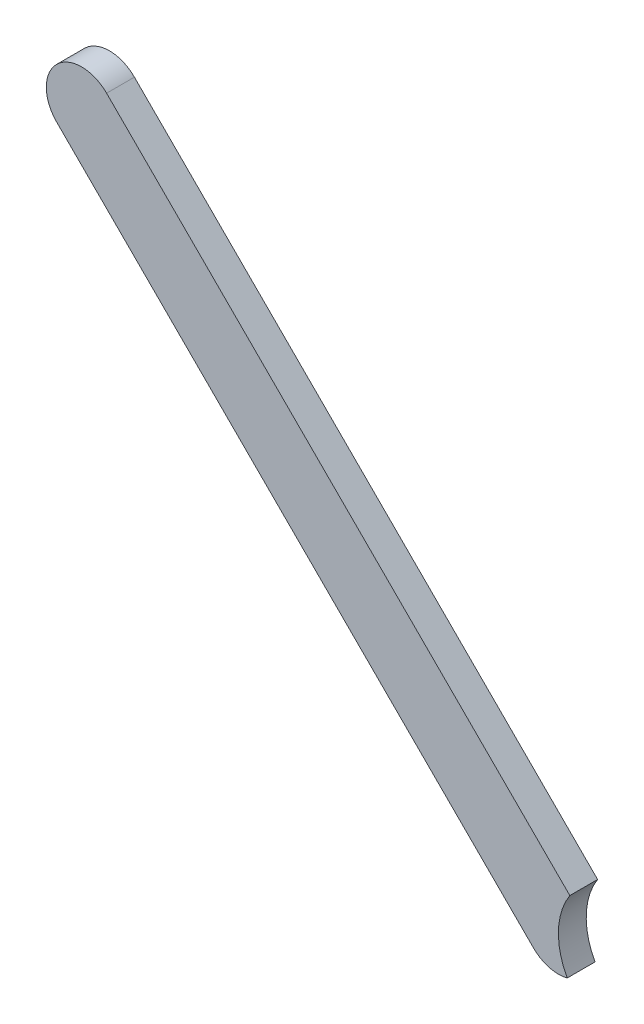
ISO-10303-21;
HEADER;
FILE_DESCRIPTION(('STEP AP214'),'2;1');
FILE_NAME('part.step','',(''),(''),'','','');
FILE_SCHEMA(('AUTOMOTIVE_DESIGN { 1 0 10303 214 1 1 1 1 }'));
ENDSEC;
DATA;
#1=APPLICATION_CONTEXT('core data for automotive mechanical design processes');
#2=APPLICATION_PROTOCOL_DEFINITION('international standard','automotive_design',2000,#1);
#3=PRODUCT_CONTEXT('',#1,'mechanical');
#4=PRODUCT('Part','Part','',(#3));
#5=PRODUCT_RELATED_PRODUCT_CATEGORY('part','',(#4));
#6=PRODUCT_DEFINITION_FORMATION('','',#4);
#7=PRODUCT_DEFINITION_CONTEXT('part definition',#1,'design');
#8=PRODUCT_DEFINITION('design','',#6,#7);
#9=PRODUCT_DEFINITION_SHAPE('','',#8);
#10=(LENGTH_UNIT() NAMED_UNIT(*) SI_UNIT(.MILLI.,.METRE.));
#11=(NAMED_UNIT(*) PLANE_ANGLE_UNIT() SI_UNIT($,.RADIAN.));
#12=(NAMED_UNIT(*) SI_UNIT($,.STERADIAN.) SOLID_ANGLE_UNIT());
#13=UNCERTAINTY_MEASURE_WITH_UNIT(LENGTH_MEASURE(1.E-05),#10,'distance_accuracy_value','');
#14=(GEOMETRIC_REPRESENTATION_CONTEXT(3) GLOBAL_UNCERTAINTY_ASSIGNED_CONTEXT((#13)) GLOBAL_UNIT_ASSIGNED_CONTEXT((#10,
#11,#12)) REPRESENTATION_CONTEXT('',''));
#15=CARTESIAN_POINT('',(0.,0.,0.));
#16=DIRECTION('',(0.,0.,1.));
#17=DIRECTION('',(1.,0.,0.));
#18=AXIS2_PLACEMENT_3D('',#15,#16,#17);
#19=CARTESIAN_POINT('',(86.05339406,77.54439406,0.));
#20=DIRECTION('',(0.707106781186548,0.707106781186548,0.));
#21=DIRECTION('',(0.707106781186548,-0.707106781186548,0.));
#22=AXIS2_PLACEMENT_3D('',#19,#20,#21);
#23=PLANE('',#22);
#24=DIRECTION('',(0.707106781186548,-0.707106781186548,0.));
#25=VECTOR('',#24,1.);
#26=CARTESIAN_POINT('',(86.05339406,77.54439406,0.1999996));
#27=LINE('',#26,#25);
#28=CARTESIAN_POINT('',(86.05339406,77.54439406,0.1999996));
#29=VERTEX_POINT('',#28);
#30=CARTESIAN_POINT('',(89.48239406,74.11539406,0.1999996));
#31=VERTEX_POINT('',#30);
#32=EDGE_CURVE('E11',#29,#31,#27,.T.);
#33=ORIENTED_EDGE('',*,*,#32,.F.);
#34=DIRECTION('',(0.,0.,1.));
#35=VECTOR('',#34,1.);
#36=CARTESIAN_POINT('',(86.05339406,77.54439406,0.));
#37=LINE('',#36,#35);
#38=CARTESIAN_POINT('',(86.05339406,77.54439406,0.));
#39=VERTEX_POINT('',#38);
#40=EDGE_CURVE('E24',#39,#29,#37,.T.);
#41=ORIENTED_EDGE('',*,*,#40,.F.);
#42=DIRECTION('',(0.707106781186548,-0.707106781186548,0.));
#43=VECTOR('',#42,1.);
#44=CARTESIAN_POINT('',(86.05339406,77.54439406,0.));
#45=LINE('',#44,#43);
#46=CARTESIAN_POINT('',(89.48239406,74.11539406,0.));
#47=VERTEX_POINT('',#46);
#48=EDGE_CURVE('E82',#39,#47,#45,.T.);
#49=ORIENTED_EDGE('',*,*,#48,.T.);
#50=DIRECTION('',(0.,0.,1.));
#51=VECTOR('',#50,1.);
#52=CARTESIAN_POINT('',(89.48239406,74.11539406,0.));
#53=LINE('',#52,#51);
#54=EDGE_CURVE('E37',#47,#31,#53,.T.);
#55=ORIENTED_EDGE('',*,*,#54,.T.);
#56=EDGE_LOOP('',(#33,#41,#49,#55));
#57=FACE_BOUND('',#56,.T.);
#58=ADVANCED_FACE('F17',(#57),#23,.F.);
#59=CARTESIAN_POINT('',(89.662,74.295,0.));
#60=DIRECTION('',(0.,0.,-1.));
#61=DIRECTION('',(-0.707106781186548,-0.707106781186548,0.));
#62=AXIS2_PLACEMENT_3D('',#59,#60,#61);
#63=CYLINDRICAL_SURFACE('',#62,0.254001156230764);
#64=CARTESIAN_POINT('',(89.662,74.295,0.1999996));
#65=DIRECTION('',(0.,0.,1.));
#66=DIRECTION('',(-0.707106781186548,-0.707106781186548,0.));
#67=AXIS2_PLACEMENT_3D('',#64,#65,#66);
#68=CIRCLE('',#67,0.254001156230764);
#69=CARTESIAN_POINT('',(89.7255005781167,74.0490645126351,0.1999996));
#70=VERTEX_POINT('',#69);
#71=EDGE_CURVE('E98',#31,#70,#68,.T.);
#72=ORIENTED_EDGE('',*,*,#71,.F.);
#73=ORIENTED_EDGE('',*,*,#54,.F.);
#74=CARTESIAN_POINT('',(89.662,74.295,0.));
#75=DIRECTION('',(0.,0.,1.));
#76=DIRECTION('',(-0.707106781186548,-0.707106781186548,0.));
#77=AXIS2_PLACEMENT_3D('',#74,#75,#76);
#78=CIRCLE('',#77,0.254001156230764);
#79=CARTESIAN_POINT('',(89.7255005781167,74.0490645126351,0.));
#80=VERTEX_POINT('',#79);
#81=EDGE_CURVE('E95',#47,#80,#78,.T.);
#82=ORIENTED_EDGE('',*,*,#81,.T.);
#83=DIRECTION('',(0.,0.,1.));
#84=VECTOR('',#83,1.);
#85=CARTESIAN_POINT('',(89.7255005781167,74.0490645126351,0.));
#86=LINE('',#85,#84);
#87=EDGE_CURVE('E93',#80,#70,#86,.T.);
#88=ORIENTED_EDGE('',*,*,#87,.T.);
#89=EDGE_LOOP('',(#72,#73,#82,#88));
#90=FACE_BOUND('',#89,.T.);
#91=ADVANCED_FACE('F104',(#90),#63,.T.);
#92=CARTESIAN_POINT('',(90.17,74.295,0.));
#93=DIRECTION('',(0.,0.,-1.));
#94=DIRECTION('',(1.,0.,0.));
#95=AXIS2_PLACEMENT_3D('',#92,#93,#94);
#96=CYLINDRICAL_SURFACE('',#95,0.508);
#97=DIRECTION('',(0.,0.,1.));
#98=VECTOR('',#97,1.);
#99=CARTESIAN_POINT('',(89.7441837952272,74.5720280847728,0.));
#100=LINE('',#99,#98);
#101=CARTESIAN_POINT('',(89.7441837952272,74.5720280847728,0.));
#102=VERTEX_POINT('',#101);
#103=CARTESIAN_POINT('',(89.7441837952272,74.5720280847728,0.1999996));
#104=VERTEX_POINT('',#103);
#105=EDGE_CURVE('E73',#102,#104,#100,.T.);
#106=ORIENTED_EDGE('',*,*,#105,.T.);
#107=CARTESIAN_POINT('',(90.17,74.295,0.1999996));
#108=DIRECTION('',(0.,0.,1.));
#109=DIRECTION('',(1.,0.,0.));
#110=AXIS2_PLACEMENT_3D('',#107,#108,#109);
#111=CIRCLE('',#110,0.508);
#112=EDGE_CURVE('E89',#104,#70,#111,.T.);
#113=ORIENTED_EDGE('',*,*,#112,.T.);
#114=ORIENTED_EDGE('',*,*,#87,.F.);
#115=CARTESIAN_POINT('',(90.17,74.295,0.));
#116=DIRECTION('',(0.,0.,1.));
#117=DIRECTION('',(1.,0.,0.));
#118=AXIS2_PLACEMENT_3D('',#115,#116,#117);
#119=CIRCLE('',#118,0.508);
#120=EDGE_CURVE('E87',#102,#80,#119,.T.);
#121=ORIENTED_EDGE('',*,*,#120,.F.);
#122=EDGE_LOOP('',(#106,#113,#114,#121));
#123=FACE_BOUND('',#122,.T.);
#124=ADVANCED_FACE('F109',(#123),#96,.F.);
#125=CARTESIAN_POINT('',(89.7441837952272,74.5720280847728,0.));
#126=DIRECTION('',(-0.707106781186546,-0.707106781186549,0.));
#127=DIRECTION('',(-0.707106781186549,0.707106781186546,0.));
#128=AXIS2_PLACEMENT_3D('',#125,#126,#127);
#129=PLANE('',#128);
#130=DIRECTION('',(-0.707106781186549,0.707106781186546,0.));
#131=VECTOR('',#130,1.);
#132=CARTESIAN_POINT('',(89.84160594,74.47460594,0.1999996));
#133=LINE('',#132,#131);
#134=CARTESIAN_POINT('',(86.41260594,77.90360594,0.1999996));
#135=VERTEX_POINT('',#134);
#136=EDGE_CURVE('E77',#104,#135,#133,.T.);
#137=ORIENTED_EDGE('',*,*,#136,.F.);
#138=ORIENTED_EDGE('',*,*,#105,.F.);
#139=DIRECTION('',(-0.707106781186549,0.707106781186546,0.));
#140=VECTOR('',#139,1.);
#141=CARTESIAN_POINT('',(89.84160594,74.47460594,0.));
#142=LINE('',#141,#140);
#143=CARTESIAN_POINT('',(86.41260594,77.90360594,0.));
#144=VERTEX_POINT('',#143);
#145=EDGE_CURVE('E69',#102,#144,#142,.T.);
#146=ORIENTED_EDGE('',*,*,#145,.T.);
#147=DIRECTION('',(0.,0.,1.));
#148=VECTOR('',#147,1.);
#149=CARTESIAN_POINT('',(86.41260594,77.90360594,0.));
#150=LINE('',#149,#148);
#151=EDGE_CURVE('E59',#144,#135,#150,.T.);
#152=ORIENTED_EDGE('',*,*,#151,.T.);
#153=EDGE_LOOP('',(#137,#138,#146,#152));
#154=FACE_BOUND('',#153,.T.);
#155=ADVANCED_FACE('F72',(#154),#129,.F.);
#156=CARTESIAN_POINT('',(86.233,77.724,0.));
#157=DIRECTION('',(0.,0.,-1.));
#158=DIRECTION('',(0.70710678118652,0.707106781186576,0.));
#159=AXIS2_PLACEMENT_3D('',#156,#157,#158);
#160=CYLINDRICAL_SURFACE('',#159,0.254001156230764);
#161=CARTESIAN_POINT('',(86.233,77.724,0.1999996));
#162=DIRECTION('',(0.,0.,1.));
#163=DIRECTION('',(0.70710678118652,0.707106781186576,0.));
#164=AXIS2_PLACEMENT_3D('',#161,#162,#163);
#165=CIRCLE('',#164,0.254001156230764);
#166=EDGE_CURVE('E65',#135,#29,#165,.T.);
#167=ORIENTED_EDGE('',*,*,#166,.F.);
#168=ORIENTED_EDGE('',*,*,#151,.F.);
#169=CARTESIAN_POINT('',(86.233,77.724,0.));
#170=DIRECTION('',(0.,0.,1.));
#171=DIRECTION('',(0.70710678118652,0.707106781186576,0.));
#172=AXIS2_PLACEMENT_3D('',#169,#170,#171);
#173=CIRCLE('',#172,0.254001156230764);
#174=EDGE_CURVE('E63',#144,#39,#173,.T.);
#175=ORIENTED_EDGE('',*,*,#174,.T.);
#176=ORIENTED_EDGE('',*,*,#40,.T.);
#177=EDGE_LOOP('',(#167,#168,#175,#176));
#178=FACE_BOUND('',#177,.T.);
#179=ADVANCED_FACE('F61',(#178),#160,.T.);
#180=CARTESIAN_POINT('',(86.05339406,77.54439406,0.));
#181=DIRECTION('',(0.,0.,-1.));
#182=DIRECTION('',(-1.,0.,0.));
#183=AXIS2_PLACEMENT_3D('',#180,#181,#182);
#184=PLANE('',#183);
#185=ORIENTED_EDGE('',*,*,#48,.F.);
#186=ORIENTED_EDGE('',*,*,#174,.F.);
#187=ORIENTED_EDGE('',*,*,#145,.F.);
#188=ORIENTED_EDGE('',*,*,#120,.T.);
#189=ORIENTED_EDGE('',*,*,#81,.F.);
#190=EDGE_LOOP('',(#185,#186,#187,#188,#189));
#191=FACE_BOUND('',#190,.T.);
#192=ADVANCED_FACE('F80',(#191),#184,.T.);
#193=CARTESIAN_POINT('',(86.05339406,77.54439406,0.1999996));
#194=DIRECTION('',(0.,0.,-1.));
#195=DIRECTION('',(-1.,0.,0.));
#196=AXIS2_PLACEMENT_3D('',#193,#194,#195);
#197=PLANE('',#196);
#198=ORIENTED_EDGE('',*,*,#166,.T.);
#199=ORIENTED_EDGE('',*,*,#32,.T.);
#200=ORIENTED_EDGE('',*,*,#71,.T.);
#201=ORIENTED_EDGE('',*,*,#112,.F.);
#202=ORIENTED_EDGE('',*,*,#136,.T.);
#203=EDGE_LOOP('',(#198,#199,#200,#201,#202));
#204=FACE_BOUND('',#203,.T.);
#205=ADVANCED_FACE('F107',(#204),#197,.F.);
#206=CLOSED_SHELL('',(#58,#91,#124,#155,#179,#192,#205));
#207=MANIFOLD_SOLID_BREP('B1',#206);
#208=ADVANCED_BREP_SHAPE_REPRESENTATION('',(#18,#207),#14);
#209=SHAPE_DEFINITION_REPRESENTATION(#9,#208);
ENDSEC;
END-ISO-10303-21;
